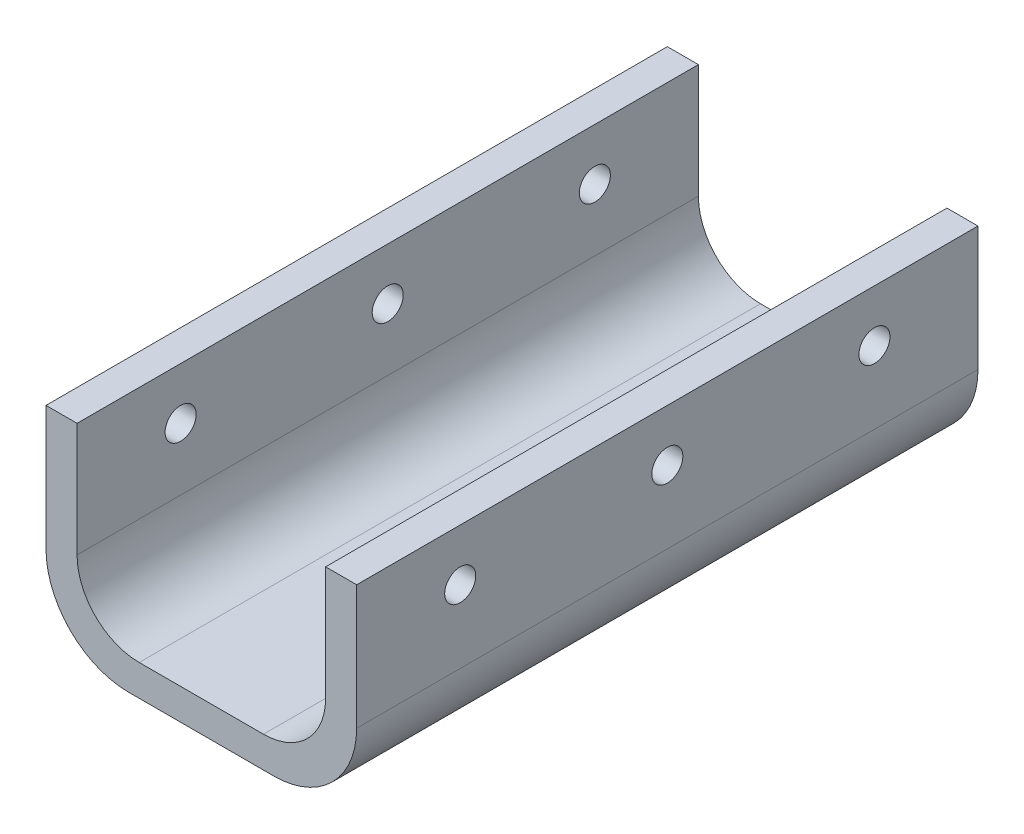
ISO-10303-21;
HEADER;
FILE_DESCRIPTION(('STEP AP214'),'2;1');
FILE_NAME('part.step','',(''),(''),'','','');
FILE_SCHEMA(('AUTOMOTIVE_DESIGN { 1 0 10303 214 1 1 1 1 }'));
ENDSEC;
DATA;
#1=APPLICATION_CONTEXT('core data for automotive mechanical design processes');
#2=APPLICATION_PROTOCOL_DEFINITION('international standard','automotive_design',2000,#1);
#3=PRODUCT_CONTEXT('',#1,'mechanical');
#4=PRODUCT('Part','Part','',(#3));
#5=PRODUCT_RELATED_PRODUCT_CATEGORY('part','',(#4));
#6=PRODUCT_DEFINITION_FORMATION('','',#4);
#7=PRODUCT_DEFINITION_CONTEXT('part definition',#1,'design');
#8=PRODUCT_DEFINITION('design','',#6,#7);
#9=PRODUCT_DEFINITION_SHAPE('','',#8);
#10=(LENGTH_UNIT() NAMED_UNIT(*) SI_UNIT(.MILLI.,.METRE.));
#11=(NAMED_UNIT(*) PLANE_ANGLE_UNIT() SI_UNIT($,.RADIAN.));
#12=(NAMED_UNIT(*) SI_UNIT($,.STERADIAN.) SOLID_ANGLE_UNIT());
#13=UNCERTAINTY_MEASURE_WITH_UNIT(LENGTH_MEASURE(1.E-05),#10,'distance_accuracy_value','');
#14=(GEOMETRIC_REPRESENTATION_CONTEXT(3) GLOBAL_UNCERTAINTY_ASSIGNED_CONTEXT((#13)) GLOBAL_UNIT_ASSIGNED_CONTEXT((#10,
#11,#12)) REPRESENTATION_CONTEXT('',''));
#15=CARTESIAN_POINT('',(0.,0.,0.));
#16=DIRECTION('',(0.,0.,1.));
#17=DIRECTION('',(1.,0.,0.));
#18=AXIS2_PLACEMENT_3D('',#15,#16,#17);
#19=CARTESIAN_POINT('',(12.,10.,200.));
#20=DIRECTION('',(0.,-1.,0.));
#21=DIRECTION('',(0.,0.,-1.));
#22=AXIS2_PLACEMENT_3D('',#19,#20,#21);
#23=PLANE('',#22);
#24=DIRECTION('',(-1.,0.,0.));
#25=VECTOR('',#24,1.);
#26=CARTESIAN_POINT('',(15.,10.,100.));
#27=LINE('',#26,#25);
#28=CARTESIAN_POINT('',(15.,10.,100.));
#29=VERTEX_POINT('',#28);
#30=CARTESIAN_POINT('',(12.,10.,100.));
#31=VERTEX_POINT('',#30);
#32=EDGE_CURVE('E125',#29,#31,#27,.T.);
#33=ORIENTED_EDGE('',*,*,#32,.F.);
#34=DIRECTION('',(0.,0.,-1.));
#35=VECTOR('',#34,1.);
#36=CARTESIAN_POINT('',(15.,10.,200.));
#37=LINE('',#36,#35);
#38=CARTESIAN_POINT('',(15.,10.,40.));
#39=VERTEX_POINT('',#38);
#40=EDGE_CURVE('E136',#29,#39,#37,.T.);
#41=ORIENTED_EDGE('',*,*,#40,.T.);
#42=DIRECTION('',(1.,0.,0.));
#43=VECTOR('',#42,1.);
#44=CARTESIAN_POINT('',(12.,10.,40.));
#45=LINE('',#44,#43);
#46=CARTESIAN_POINT('',(12.,10.,40.));
#47=VERTEX_POINT('',#46);
#48=EDGE_CURVE('E202',#47,#39,#45,.T.);
#49=ORIENTED_EDGE('',*,*,#48,.F.);
#50=DIRECTION('',(0.,0.,-1.));
#51=VECTOR('',#50,1.);
#52=CARTESIAN_POINT('',(12.,10.,200.));
#53=LINE('',#52,#51);
#54=EDGE_CURVE('E138',#31,#47,#53,.T.);
#55=ORIENTED_EDGE('',*,*,#54,.F.);
#56=EDGE_LOOP('',(#33,#41,#49,#55));
#57=FACE_BOUND('',#56,.T.);
#58=ADVANCED_FACE('F35',(#57),#23,.F.);
#59=CARTESIAN_POINT('',(12.,-7.,200.));
#60=DIRECTION('',(1.,0.,0.));
#61=DIRECTION('',(0.,0.,-1.));
#62=AXIS2_PLACEMENT_3D('',#59,#60,#61);
#63=PLANE('',#62);
#64=CARTESIAN_POINT('',(12.,4.99999999999988,70.));
#65=DIRECTION('',(1.,0.,0.));
#66=DIRECTION('',(0.,0.,-1.));
#67=AXIS2_PLACEMENT_3D('',#64,#65,#66);
#68=CIRCLE('',#67,1.5);
#69=CARTESIAN_POINT('',(12.,4.99999999999988,68.5));
#70=VERTEX_POINT('',#69);
#71=EDGE_CURVE('E146',#70,#70,#68,.T.);
#72=ORIENTED_EDGE('',*,*,#71,.T.);
#73=EDGE_LOOP('',(#72));
#74=FACE_BOUND('',#73,.T.);
#75=CARTESIAN_POINT('',(12.,4.99999999999974,50.));
#76=DIRECTION('',(1.,0.,0.));
#77=DIRECTION('',(0.,0.,-1.));
#78=AXIS2_PLACEMENT_3D('',#75,#76,#77);
#79=CIRCLE('',#78,1.5);
#80=CARTESIAN_POINT('',(12.,4.99999999999974,48.5));
#81=VERTEX_POINT('',#80);
#82=EDGE_CURVE('E254',#81,#81,#79,.T.);
#83=ORIENTED_EDGE('',*,*,#82,.T.);
#84=EDGE_LOOP('',(#83));
#85=FACE_BOUND('',#84,.T.);
#86=CARTESIAN_POINT('',(12.,5.00000000000002,90.));
#87=DIRECTION('',(1.,0.,0.));
#88=DIRECTION('',(0.,0.,-1.));
#89=AXIS2_PLACEMENT_3D('',#86,#87,#88);
#90=CIRCLE('',#89,1.5);
#91=CARTESIAN_POINT('',(12.,5.00000000000002,88.5));
#92=VERTEX_POINT('',#91);
#93=EDGE_CURVE('E248',#92,#92,#90,.T.);
#94=ORIENTED_EDGE('',*,*,#93,.T.);
#95=EDGE_LOOP('',(#94));
#96=FACE_BOUND('',#95,.T.);
#97=DIRECTION('',(0.,-1.,0.));
#98=VECTOR('',#97,1.);
#99=CARTESIAN_POINT('',(12.,10.,100.));
#100=LINE('',#99,#98);
#101=CARTESIAN_POINT('',(12.,-1.,100.));
#102=VERTEX_POINT('',#101);
#103=EDGE_CURVE('E139',#31,#102,#100,.T.);
#104=ORIENTED_EDGE('',*,*,#103,.F.);
#105=ORIENTED_EDGE('',*,*,#54,.T.);
#106=DIRECTION('',(0.,1.,0.));
#107=VECTOR('',#106,1.);
#108=CARTESIAN_POINT('',(12.,-0.999999999999999,40.));
#109=LINE('',#108,#107);
#110=CARTESIAN_POINT('',(12.,-0.999999999999999,40.));
#111=VERTEX_POINT('',#110);
#112=EDGE_CURVE('E177',#111,#47,#109,.T.);
#113=ORIENTED_EDGE('',*,*,#112,.F.);
#114=DIRECTION('',(0.,0.,-1.));
#115=VECTOR('',#114,1.);
#116=CARTESIAN_POINT('',(12.,-1.,200.));
#117=LINE('',#116,#115);
#118=EDGE_CURVE('E43',#111,#102,#117,.F.);
#119=ORIENTED_EDGE('',*,*,#118,.T.);
#120=EDGE_LOOP('',(#104,#105,#113,#119));
#121=FACE_BOUND('',#120,.T.);
#122=ADVANCED_FACE('F175',(#74,#85,#96,#121),#63,.F.);
#123=CARTESIAN_POINT('',(-12.,-7.,200.));
#124=DIRECTION('',(0.,-1.,0.));
#125=DIRECTION('',(0.,0.,-1.));
#126=AXIS2_PLACEMENT_3D('',#123,#124,#125);
#127=PLANE('',#126);
#128=DIRECTION('',(-1.,0.,0.));
#129=VECTOR('',#128,1.);
#130=CARTESIAN_POINT('',(6.,-7.,100.));
#131=LINE('',#130,#129);
#132=CARTESIAN_POINT('',(6.,-7.,100.));
#133=VERTEX_POINT('',#132);
#134=CARTESIAN_POINT('',(-6.,-7.,100.));
#135=VERTEX_POINT('',#134);
#136=EDGE_CURVE('E50',#133,#135,#131,.T.);
#137=ORIENTED_EDGE('',*,*,#136,.F.);
#138=DIRECTION('',(0.,0.,-1.));
#139=VECTOR('',#138,1.);
#140=CARTESIAN_POINT('',(6.,-7.,0.));
#141=LINE('',#140,#139);
#142=CARTESIAN_POINT('',(6.,-7.,40.));
#143=VERTEX_POINT('',#142);
#144=EDGE_CURVE('E170',#133,#143,#141,.T.);
#145=ORIENTED_EDGE('',*,*,#144,.T.);
#146=DIRECTION('',(1.,0.,0.));
#147=VECTOR('',#146,1.);
#148=CARTESIAN_POINT('',(-6.,-7.,40.));
#149=LINE('',#148,#147);
#150=CARTESIAN_POINT('',(-6.,-7.,40.));
#151=VERTEX_POINT('',#150);
#152=EDGE_CURVE('E222',#151,#143,#149,.T.);
#153=ORIENTED_EDGE('',*,*,#152,.F.);
#154=DIRECTION('',(0.,0.,-1.));
#155=VECTOR('',#154,1.);
#156=CARTESIAN_POINT('',(-6.,-7.,200.));
#157=LINE('',#156,#155);
#158=EDGE_CURVE('E167',#151,#135,#157,.F.);
#159=ORIENTED_EDGE('',*,*,#158,.T.);
#160=EDGE_LOOP('',(#137,#145,#153,#159));
#161=FACE_BOUND('',#160,.T.);
#162=ADVANCED_FACE('F288',(#161),#127,.F.);
#163=CARTESIAN_POINT('',(-12.,-7.,200.));
#164=DIRECTION('',(-1.,0.,0.));
#165=DIRECTION('',(0.,0.,1.));
#166=AXIS2_PLACEMENT_3D('',#163,#164,#165);
#167=PLANE('',#166);
#168=CARTESIAN_POINT('',(-12.,4.99999999999988,70.));
#169=DIRECTION('',(-1.,0.,0.));
#170=DIRECTION('',(0.,0.,1.));
#171=AXIS2_PLACEMENT_3D('',#168,#169,#170);
#172=CIRCLE('',#171,1.5);
#173=CARTESIAN_POINT('',(-12.,4.99999999999988,71.5));
#174=VERTEX_POINT('',#173);
#175=EDGE_CURVE('E151',#174,#174,#172,.T.);
#176=ORIENTED_EDGE('',*,*,#175,.T.);
#177=EDGE_LOOP('',(#176));
#178=FACE_BOUND('',#177,.T.);
#179=CARTESIAN_POINT('',(-12.,4.99999999999974,50.));
#180=DIRECTION('',(-1.,0.,0.));
#181=DIRECTION('',(0.,0.,1.));
#182=AXIS2_PLACEMENT_3D('',#179,#180,#181);
#183=CIRCLE('',#182,1.5);
#184=CARTESIAN_POINT('',(-12.,4.99999999999974,51.5));
#185=VERTEX_POINT('',#184);
#186=EDGE_CURVE('E251',#185,#185,#183,.T.);
#187=ORIENTED_EDGE('',*,*,#186,.T.);
#188=EDGE_LOOP('',(#187));
#189=FACE_BOUND('',#188,.T.);
#190=CARTESIAN_POINT('',(-12.,5.00000000000002,90.));
#191=DIRECTION('',(-1.,0.,0.));
#192=DIRECTION('',(0.,0.,1.));
#193=AXIS2_PLACEMENT_3D('',#190,#191,#192);
#194=CIRCLE('',#193,1.5);
#195=CARTESIAN_POINT('',(-12.,5.00000000000002,91.5));
#196=VERTEX_POINT('',#195);
#197=EDGE_CURVE('E243',#196,#196,#194,.T.);
#198=ORIENTED_EDGE('',*,*,#197,.T.);
#199=EDGE_LOOP('',(#198));
#200=FACE_BOUND('',#199,.T.);
#201=DIRECTION('',(0.,1.,0.));
#202=VECTOR('',#201,1.);
#203=CARTESIAN_POINT('',(-12.,-0.999999999999999,100.));
#204=LINE('',#203,#202);
#205=CARTESIAN_POINT('',(-12.,-0.999999999999999,100.));
#206=VERTEX_POINT('',#205);
#207=CARTESIAN_POINT('',(-12.,10.,100.));
#208=VERTEX_POINT('',#207);
#209=EDGE_CURVE('E191',#206,#208,#204,.T.);
#210=ORIENTED_EDGE('',*,*,#209,.F.);
#211=DIRECTION('',(0.,0.,-1.));
#212=VECTOR('',#211,1.);
#213=CARTESIAN_POINT('',(-12.,-1.,0.));
#214=LINE('',#213,#212);
#215=CARTESIAN_POINT('',(-12.,-1.,40.));
#216=VERTEX_POINT('',#215);
#217=EDGE_CURVE('E11',#206,#216,#214,.T.);
#218=ORIENTED_EDGE('',*,*,#217,.T.);
#219=DIRECTION('',(0.,-1.,0.));
#220=VECTOR('',#219,1.);
#221=CARTESIAN_POINT('',(-12.,10.,40.));
#222=LINE('',#221,#220);
#223=CARTESIAN_POINT('',(-12.,10.,40.));
#224=VERTEX_POINT('',#223);
#225=EDGE_CURVE('E218',#224,#216,#222,.T.);
#226=ORIENTED_EDGE('',*,*,#225,.F.);
#227=DIRECTION('',(0.,0.,-1.));
#228=VECTOR('',#227,1.);
#229=CARTESIAN_POINT('',(-12.,10.,200.));
#230=LINE('',#229,#228);
#231=EDGE_CURVE('E148',#208,#224,#230,.T.);
#232=ORIENTED_EDGE('',*,*,#231,.F.);
#233=EDGE_LOOP('',(#210,#218,#226,#232));
#234=FACE_BOUND('',#233,.T.);
#235=ADVANCED_FACE('F259',(#178,#189,#200,#234),#167,.F.);
#236=CARTESIAN_POINT('',(-12.,10.,200.));
#237=DIRECTION('',(0.,-1.,0.));
#238=DIRECTION('',(0.,0.,-1.));
#239=AXIS2_PLACEMENT_3D('',#236,#237,#238);
#240=PLANE('',#239);
#241=DIRECTION('',(-1.,0.,0.));
#242=VECTOR('',#241,1.);
#243=CARTESIAN_POINT('',(-12.,10.,100.));
#244=LINE('',#243,#242);
#245=CARTESIAN_POINT('',(-15.,10.,100.));
#246=VERTEX_POINT('',#245);
#247=EDGE_CURVE('E193',#208,#246,#244,.T.);
#248=ORIENTED_EDGE('',*,*,#247,.F.);
#249=ORIENTED_EDGE('',*,*,#231,.T.);
#250=DIRECTION('',(1.,0.,0.));
#251=VECTOR('',#250,1.);
#252=CARTESIAN_POINT('',(-15.,10.,40.));
#253=LINE('',#252,#251);
#254=CARTESIAN_POINT('',(-15.,10.,40.));
#255=VERTEX_POINT('',#254);
#256=EDGE_CURVE('E215',#255,#224,#253,.T.);
#257=ORIENTED_EDGE('',*,*,#256,.F.);
#258=DIRECTION('',(0.,0.,-1.));
#259=VECTOR('',#258,1.);
#260=CARTESIAN_POINT('',(-15.,10.,200.));
#261=LINE('',#260,#259);
#262=EDGE_CURVE('E145',#246,#255,#261,.T.);
#263=ORIENTED_EDGE('',*,*,#262,.F.);
#264=EDGE_LOOP('',(#248,#249,#257,#263));
#265=FACE_BOUND('',#264,.T.);
#266=ADVANCED_FACE('F319',(#265),#240,.F.);
#267=CARTESIAN_POINT('',(-15.,-10.,200.));
#268=DIRECTION('',(1.,0.,0.));
#269=DIRECTION('',(0.,0.,-1.));
#270=AXIS2_PLACEMENT_3D('',#267,#268,#269);
#271=PLANE('',#270);
#272=CARTESIAN_POINT('',(-15.,4.99999999999988,70.));
#273=DIRECTION('',(-1.,0.,0.));
#274=DIRECTION('',(0.,0.,1.));
#275=AXIS2_PLACEMENT_3D('',#272,#273,#274);
#276=CIRCLE('',#275,1.5);
#277=CARTESIAN_POINT('',(-15.,4.99999999999988,71.5));
#278=VERTEX_POINT('',#277);
#279=EDGE_CURVE('E232',#278,#278,#276,.T.);
#280=ORIENTED_EDGE('',*,*,#279,.F.);
#281=EDGE_LOOP('',(#280));
#282=FACE_BOUND('',#281,.T.);
#283=CARTESIAN_POINT('',(-15.,4.99999999999974,50.));
#284=DIRECTION('',(-1.,0.,0.));
#285=DIRECTION('',(0.,0.,1.));
#286=AXIS2_PLACEMENT_3D('',#283,#284,#285);
#287=CIRCLE('',#286,1.5);
#288=CARTESIAN_POINT('',(-15.,4.99999999999974,51.5));
#289=VERTEX_POINT('',#288);
#290=EDGE_CURVE('E227',#289,#289,#287,.T.);
#291=ORIENTED_EDGE('',*,*,#290,.F.);
#292=EDGE_LOOP('',(#291));
#293=FACE_BOUND('',#292,.T.);
#294=CARTESIAN_POINT('',(-15.,5.00000000000002,90.));
#295=DIRECTION('',(-1.,0.,0.));
#296=DIRECTION('',(0.,0.,1.));
#297=AXIS2_PLACEMENT_3D('',#294,#295,#296);
#298=CIRCLE('',#297,1.5);
#299=CARTESIAN_POINT('',(-15.,5.00000000000002,91.5));
#300=VERTEX_POINT('',#299);
#301=EDGE_CURVE('E231',#300,#300,#298,.T.);
#302=ORIENTED_EDGE('',*,*,#301,.F.);
#303=EDGE_LOOP('',(#302));
#304=FACE_BOUND('',#303,.T.);
#305=DIRECTION('',(0.,-1.,0.));
#306=VECTOR('',#305,1.);
#307=CARTESIAN_POINT('',(-15.,10.,100.));
#308=LINE('',#307,#306);
#309=CARTESIAN_POINT('',(-15.,-2.,100.));
#310=VERTEX_POINT('',#309);
#311=EDGE_CURVE('E195',#246,#310,#308,.T.);
#312=ORIENTED_EDGE('',*,*,#311,.F.);
#313=ORIENTED_EDGE('',*,*,#262,.T.);
#314=DIRECTION('',(0.,1.,0.));
#315=VECTOR('',#314,1.);
#316=CARTESIAN_POINT('',(-15.,-2.,40.));
#317=LINE('',#316,#315);
#318=CARTESIAN_POINT('',(-15.,-2.,40.));
#319=VERTEX_POINT('',#318);
#320=EDGE_CURVE('E212',#319,#255,#317,.T.);
#321=ORIENTED_EDGE('',*,*,#320,.F.);
#322=DIRECTION('',(0.,0.,-1.));
#323=VECTOR('',#322,1.);
#324=CARTESIAN_POINT('',(-15.,-2.,200.));
#325=LINE('',#324,#323);
#326=EDGE_CURVE('E164',#319,#310,#325,.F.);
#327=ORIENTED_EDGE('',*,*,#326,.T.);
#328=EDGE_LOOP('',(#312,#313,#321,#327));
#329=FACE_BOUND('',#328,.T.);
#330=ADVANCED_FACE('F324',(#282,#293,#304,#329),#271,.F.);
#331=CARTESIAN_POINT('',(-15.,-10.,200.));
#332=DIRECTION('',(0.,1.,0.));
#333=DIRECTION('',(0.,0.,1.));
#334=AXIS2_PLACEMENT_3D('',#331,#332,#333);
#335=PLANE('',#334);
#336=DIRECTION('',(1.,0.,0.));
#337=VECTOR('',#336,1.);
#338=CARTESIAN_POINT('',(-7.,-10.,100.));
#339=LINE('',#338,#337);
#340=CARTESIAN_POINT('',(-7.,-10.,100.));
#341=VERTEX_POINT('',#340);
#342=CARTESIAN_POINT('',(7.,-10.,100.));
#343=VERTEX_POINT('',#342);
#344=EDGE_CURVE('E199',#341,#343,#339,.T.);
#345=ORIENTED_EDGE('',*,*,#344,.F.);
#346=DIRECTION('',(0.,0.,-1.));
#347=VECTOR('',#346,1.);
#348=CARTESIAN_POINT('',(-7.,-10.,200.));
#349=LINE('',#348,#347);
#350=CARTESIAN_POINT('',(-7.,-10.,40.));
#351=VERTEX_POINT('',#350);
#352=EDGE_CURVE('E159',#341,#351,#349,.T.);
#353=ORIENTED_EDGE('',*,*,#352,.T.);
#354=DIRECTION('',(-1.,0.,0.));
#355=VECTOR('',#354,1.);
#356=CARTESIAN_POINT('',(7.,-10.,40.));
#357=LINE('',#356,#355);
#358=CARTESIAN_POINT('',(7.,-10.,40.));
#359=VERTEX_POINT('',#358);
#360=EDGE_CURVE('E207',#359,#351,#357,.T.);
#361=ORIENTED_EDGE('',*,*,#360,.F.);
#362=DIRECTION('',(0.,0.,-1.));
#363=VECTOR('',#362,1.);
#364=CARTESIAN_POINT('',(7.,-10.,200.));
#365=LINE('',#364,#363);
#366=EDGE_CURVE('E161',#359,#343,#365,.F.);
#367=ORIENTED_EDGE('',*,*,#366,.T.);
#368=EDGE_LOOP('',(#345,#353,#361,#367));
#369=FACE_BOUND('',#368,.T.);
#370=ADVANCED_FACE('F331',(#369),#335,.F.);
#371=CARTESIAN_POINT('',(15.,-10.,200.));
#372=DIRECTION('',(-1.,0.,0.));
#373=DIRECTION('',(0.,0.,1.));
#374=AXIS2_PLACEMENT_3D('',#371,#372,#373);
#375=PLANE('',#374);
#376=CARTESIAN_POINT('',(15.,4.99999999999988,70.));
#377=DIRECTION('',(-1.,0.,0.));
#378=DIRECTION('',(0.,0.,1.));
#379=AXIS2_PLACEMENT_3D('',#376,#377,#378);
#380=CIRCLE('',#379,1.5);
#381=CARTESIAN_POINT('',(15.,4.99999999999988,71.5));
#382=VERTEX_POINT('',#381);
#383=EDGE_CURVE('E228',#382,#382,#380,.T.);
#384=ORIENTED_EDGE('',*,*,#383,.T.);
#385=EDGE_LOOP('',(#384));
#386=FACE_BOUND('',#385,.T.);
#387=CARTESIAN_POINT('',(15.,4.99999999999974,50.));
#388=DIRECTION('',(-1.,0.,0.));
#389=DIRECTION('',(0.,0.,1.));
#390=AXIS2_PLACEMENT_3D('',#387,#388,#389);
#391=CIRCLE('',#390,1.5);
#392=CARTESIAN_POINT('',(15.,4.99999999999974,51.5));
#393=VERTEX_POINT('',#392);
#394=EDGE_CURVE('E235',#393,#393,#391,.T.);
#395=ORIENTED_EDGE('',*,*,#394,.T.);
#396=EDGE_LOOP('',(#395));
#397=FACE_BOUND('',#396,.T.);
#398=CARTESIAN_POINT('',(15.,5.00000000000002,90.));
#399=DIRECTION('',(-1.,0.,0.));
#400=DIRECTION('',(0.,0.,1.));
#401=AXIS2_PLACEMENT_3D('',#398,#399,#400);
#402=CIRCLE('',#401,1.5);
#403=CARTESIAN_POINT('',(15.,5.00000000000002,91.5));
#404=VERTEX_POINT('',#403);
#405=EDGE_CURVE('E240',#404,#404,#402,.T.);
#406=ORIENTED_EDGE('',*,*,#405,.T.);
#407=EDGE_LOOP('',(#406));
#408=FACE_BOUND('',#407,.T.);
#409=DIRECTION('',(0.,1.,0.));
#410=VECTOR('',#409,1.);
#411=CARTESIAN_POINT('',(15.,-2.,100.));
#412=LINE('',#411,#410);
#413=CARTESIAN_POINT('',(15.,-2.,100.));
#414=VERTEX_POINT('',#413);
#415=EDGE_CURVE('E122',#414,#29,#412,.T.);
#416=ORIENTED_EDGE('',*,*,#415,.F.);
#417=DIRECTION('',(0.,0.,-1.));
#418=VECTOR('',#417,1.);
#419=CARTESIAN_POINT('',(15.,-2.,200.));
#420=LINE('',#419,#418);
#421=CARTESIAN_POINT('',(15.,-2.,40.));
#422=VERTEX_POINT('',#421);
#423=EDGE_CURVE('E157',#414,#422,#420,.T.);
#424=ORIENTED_EDGE('',*,*,#423,.T.);
#425=DIRECTION('',(0.,-1.,0.));
#426=VECTOR('',#425,1.);
#427=CARTESIAN_POINT('',(15.,10.,40.));
#428=LINE('',#427,#426);
#429=EDGE_CURVE('E144',#39,#422,#428,.T.);
#430=ORIENTED_EDGE('',*,*,#429,.F.);
#431=ORIENTED_EDGE('',*,*,#40,.F.);
#432=EDGE_LOOP('',(#416,#424,#430,#431));
#433=FACE_BOUND('',#432,.T.);
#434=ADVANCED_FACE('F142',(#386,#397,#408,#433),#375,.F.);
#435=CARTESIAN_POINT('',(7.,-2.,200.));
#436=DIRECTION('',(0.,0.,-1.));
#437=DIRECTION('',(-1.,0.,0.));
#438=AXIS2_PLACEMENT_3D('',#435,#436,#437);
#439=CYLINDRICAL_SURFACE('',#438,8.);
#440=ORIENTED_EDGE('',*,*,#423,.F.);
#441=CARTESIAN_POINT('',(7.,-2.,100.));
#442=DIRECTION('',(0.,0.,1.));
#443=DIRECTION('',(1.,0.,0.));
#444=AXIS2_PLACEMENT_3D('',#441,#442,#443);
#445=CIRCLE('',#444,8.);
#446=EDGE_CURVE('E128',#343,#414,#445,.T.);
#447=ORIENTED_EDGE('',*,*,#446,.F.);
#448=ORIENTED_EDGE('',*,*,#366,.F.);
#449=CARTESIAN_POINT('',(7.,-2.,40.));
#450=DIRECTION('',(0.,0.,-1.));
#451=DIRECTION('',(-1.,0.,0.));
#452=AXIS2_PLACEMENT_3D('',#449,#450,#451);
#453=CIRCLE('',#452,8.);
#454=EDGE_CURVE('E205',#422,#359,#453,.T.);
#455=ORIENTED_EDGE('',*,*,#454,.F.);
#456=EDGE_LOOP('',(#440,#447,#448,#455));
#457=FACE_BOUND('',#456,.T.);
#458=ADVANCED_FACE('F293',(#457),#439,.T.);
#459=CARTESIAN_POINT('',(-7.,-2.,200.));
#460=DIRECTION('',(0.,0.,-1.));
#461=DIRECTION('',(-1.,0.,0.));
#462=AXIS2_PLACEMENT_3D('',#459,#460,#461);
#463=CYLINDRICAL_SURFACE('',#462,8.);
#464=ORIENTED_EDGE('',*,*,#352,.F.);
#465=CARTESIAN_POINT('',(-7.,-2.,100.));
#466=DIRECTION('',(0.,0.,1.));
#467=DIRECTION('',(1.,0.,0.));
#468=AXIS2_PLACEMENT_3D('',#465,#466,#467);
#469=CIRCLE('',#468,8.);
#470=EDGE_CURVE('E197',#310,#341,#469,.T.);
#471=ORIENTED_EDGE('',*,*,#470,.F.);
#472=ORIENTED_EDGE('',*,*,#326,.F.);
#473=CARTESIAN_POINT('',(-7.,-2.,40.));
#474=DIRECTION('',(0.,0.,-1.));
#475=DIRECTION('',(-1.,0.,0.));
#476=AXIS2_PLACEMENT_3D('',#473,#474,#475);
#477=CIRCLE('',#476,8.);
#478=EDGE_CURVE('E210',#351,#319,#477,.T.);
#479=ORIENTED_EDGE('',*,*,#478,.F.);
#480=EDGE_LOOP('',(#464,#471,#472,#479));
#481=FACE_BOUND('',#480,.T.);
#482=ADVANCED_FACE('F296',(#481),#463,.T.);
#483=CARTESIAN_POINT('',(6.,-1.,200.));
#484=DIRECTION('',(0.,0.,1.));
#485=DIRECTION('',(1.,0.,0.));
#486=AXIS2_PLACEMENT_3D('',#483,#484,#485);
#487=CYLINDRICAL_SURFACE('',#486,6.);
#488=CARTESIAN_POINT('',(6.,-1.,100.));
#489=DIRECTION('',(0.,0.,-1.));
#490=DIRECTION('',(1.,0.,0.));
#491=AXIS2_PLACEMENT_3D('',#488,#489,#490);
#492=CIRCLE('',#491,6.);
#493=EDGE_CURVE('E184',#102,#133,#492,.T.);
#494=ORIENTED_EDGE('',*,*,#493,.F.);
#495=ORIENTED_EDGE('',*,*,#118,.F.);
#496=CARTESIAN_POINT('',(6.,-1.,40.));
#497=DIRECTION('',(0.,0.,1.));
#498=DIRECTION('',(-1.,0.,0.));
#499=AXIS2_PLACEMENT_3D('',#496,#497,#498);
#500=CIRCLE('',#499,6.);
#501=EDGE_CURVE('E183',#143,#111,#500,.T.);
#502=ORIENTED_EDGE('',*,*,#501,.F.);
#503=ORIENTED_EDGE('',*,*,#144,.F.);
#504=EDGE_LOOP('',(#494,#495,#502,#503));
#505=FACE_BOUND('',#504,.T.);
#506=ADVANCED_FACE('F181',(#505),#487,.F.);
#507=CARTESIAN_POINT('',(-6.,-1.,200.));
#508=DIRECTION('',(0.,0.,1.));
#509=DIRECTION('',(1.,0.,0.));
#510=AXIS2_PLACEMENT_3D('',#507,#508,#509);
#511=CYLINDRICAL_SURFACE('',#510,6.);
#512=CARTESIAN_POINT('',(-6.,-1.,100.));
#513=DIRECTION('',(0.,0.,-1.));
#514=DIRECTION('',(1.,0.,0.));
#515=AXIS2_PLACEMENT_3D('',#512,#513,#514);
#516=CIRCLE('',#515,6.);
#517=EDGE_CURVE('E186',#135,#206,#516,.T.);
#518=ORIENTED_EDGE('',*,*,#517,.F.);
#519=ORIENTED_EDGE('',*,*,#158,.F.);
#520=CARTESIAN_POINT('',(-6.,-1.,40.));
#521=DIRECTION('',(0.,0.,1.));
#522=DIRECTION('',(-1.,0.,0.));
#523=AXIS2_PLACEMENT_3D('',#520,#521,#522);
#524=CIRCLE('',#523,6.);
#525=EDGE_CURVE('E220',#216,#151,#524,.T.);
#526=ORIENTED_EDGE('',*,*,#525,.F.);
#527=ORIENTED_EDGE('',*,*,#217,.F.);
#528=EDGE_LOOP('',(#518,#519,#526,#527));
#529=FACE_BOUND('',#528,.T.);
#530=ADVANCED_FACE('F37',(#529),#511,.F.);
#531=CARTESIAN_POINT('',(15.,5.00000000000002,90.));
#532=DIRECTION('',(-1.,0.,0.));
#533=DIRECTION('',(0.,0.,1.));
#534=AXIS2_PLACEMENT_3D('',#531,#532,#533);
#535=CYLINDRICAL_SURFACE('',#534,1.5);
#536=ORIENTED_EDGE('',*,*,#405,.F.);
#537=EDGE_LOOP('',(#536));
#538=FACE_BOUND('',#537,.T.);
#539=ORIENTED_EDGE('',*,*,#93,.F.);
#540=EDGE_LOOP('',(#539));
#541=FACE_BOUND('',#540,.T.);
#542=ADVANCED_FACE('F304',(#538,#541),#535,.F.);
#543=CARTESIAN_POINT('',(15.,4.99999999999974,50.));
#544=DIRECTION('',(-1.,0.,0.));
#545=DIRECTION('',(0.,0.,1.));
#546=AXIS2_PLACEMENT_3D('',#543,#544,#545);
#547=CYLINDRICAL_SURFACE('',#546,1.5);
#548=ORIENTED_EDGE('',*,*,#394,.F.);
#549=EDGE_LOOP('',(#548));
#550=FACE_BOUND('',#549,.T.);
#551=ORIENTED_EDGE('',*,*,#82,.F.);
#552=EDGE_LOOP('',(#551));
#553=FACE_BOUND('',#552,.T.);
#554=ADVANCED_FACE('F279',(#550,#553),#547,.F.);
#555=CARTESIAN_POINT('',(15.,4.99999999999988,70.));
#556=DIRECTION('',(-1.,0.,0.));
#557=DIRECTION('',(0.,0.,1.));
#558=AXIS2_PLACEMENT_3D('',#555,#556,#557);
#559=CYLINDRICAL_SURFACE('',#558,1.5);
#560=ORIENTED_EDGE('',*,*,#383,.F.);
#561=EDGE_LOOP('',(#560));
#562=FACE_BOUND('',#561,.T.);
#563=ORIENTED_EDGE('',*,*,#71,.F.);
#564=EDGE_LOOP('',(#563));
#565=FACE_BOUND('',#564,.T.);
#566=ADVANCED_FACE('F268',(#562,#565),#559,.F.);
#567=ORIENTED_EDGE('',*,*,#301,.T.);
#568=EDGE_LOOP('',(#567));
#569=FACE_BOUND('',#568,.T.);
#570=ORIENTED_EDGE('',*,*,#197,.F.);
#571=EDGE_LOOP('',(#570));
#572=FACE_BOUND('',#571,.T.);
#573=ADVANCED_FACE('F276',(#569,#572),#535,.F.);
#574=ORIENTED_EDGE('',*,*,#290,.T.);
#575=EDGE_LOOP('',(#574));
#576=FACE_BOUND('',#575,.T.);
#577=ORIENTED_EDGE('',*,*,#186,.F.);
#578=EDGE_LOOP('',(#577));
#579=FACE_BOUND('',#578,.T.);
#580=ADVANCED_FACE('F265',(#576,#579),#547,.F.);
#581=ORIENTED_EDGE('',*,*,#279,.T.);
#582=EDGE_LOOP('',(#581));
#583=FACE_BOUND('',#582,.T.);
#584=ORIENTED_EDGE('',*,*,#175,.F.);
#585=EDGE_LOOP('',(#584));
#586=FACE_BOUND('',#585,.T.);
#587=ADVANCED_FACE('F262',(#583,#586),#559,.F.);
#588=CARTESIAN_POINT('',(7.,-2.,40.));
#589=DIRECTION('',(0.,0.,-1.));
#590=DIRECTION('',(-1.,0.,0.));
#591=AXIS2_PLACEMENT_3D('',#588,#589,#590);
#592=PLANE('',#591);
#593=ORIENTED_EDGE('',*,*,#48,.T.);
#594=ORIENTED_EDGE('',*,*,#429,.T.);
#595=ORIENTED_EDGE('',*,*,#454,.T.);
#596=ORIENTED_EDGE('',*,*,#360,.T.);
#597=ORIENTED_EDGE('',*,*,#478,.T.);
#598=ORIENTED_EDGE('',*,*,#320,.T.);
#599=ORIENTED_EDGE('',*,*,#256,.T.);
#600=ORIENTED_EDGE('',*,*,#225,.T.);
#601=ORIENTED_EDGE('',*,*,#525,.T.);
#602=ORIENTED_EDGE('',*,*,#152,.T.);
#603=ORIENTED_EDGE('',*,*,#501,.T.);
#604=ORIENTED_EDGE('',*,*,#112,.T.);
#605=EDGE_LOOP('',(#593,#594,#595,#596,#597,#598,#599,#600,#601,#602,#603,#604));
#606=FACE_BOUND('',#605,.T.);
#607=ADVANCED_FACE('F264',(#606),#592,.T.);
#608=CARTESIAN_POINT('',(6.,-1.,100.));
#609=DIRECTION('',(0.,0.,1.));
#610=DIRECTION('',(1.,0.,0.));
#611=AXIS2_PLACEMENT_3D('',#608,#609,#610);
#612=PLANE('',#611);
#613=ORIENTED_EDGE('',*,*,#415,.T.);
#614=ORIENTED_EDGE('',*,*,#32,.T.);
#615=ORIENTED_EDGE('',*,*,#103,.T.);
#616=ORIENTED_EDGE('',*,*,#493,.T.);
#617=ORIENTED_EDGE('',*,*,#136,.T.);
#618=ORIENTED_EDGE('',*,*,#517,.T.);
#619=ORIENTED_EDGE('',*,*,#209,.T.);
#620=ORIENTED_EDGE('',*,*,#247,.T.);
#621=ORIENTED_EDGE('',*,*,#311,.T.);
#622=ORIENTED_EDGE('',*,*,#470,.T.);
#623=ORIENTED_EDGE('',*,*,#344,.T.);
#624=ORIENTED_EDGE('',*,*,#446,.T.);
#625=EDGE_LOOP('',(#613,#614,#615,#616,#617,#618,#619,#620,#621,#622,#623,#624));
#626=FACE_BOUND('',#625,.T.);
#627=ADVANCED_FACE('F124',(#626),#612,.T.);
#628=CLOSED_SHELL('',(#58,#122,#162,#235,#266,#330,#370,#434,#458,#482,#506,#530,#542,#554,#566,
#573,#580,#587,#607,#627));
#629=MANIFOLD_SOLID_BREP('B2',#628);
#630=ADVANCED_BREP_SHAPE_REPRESENTATION('',(#18,#629),#14);
#631=SHAPE_DEFINITION_REPRESENTATION(#9,#630);
ENDSEC;
END-ISO-10303-21;
